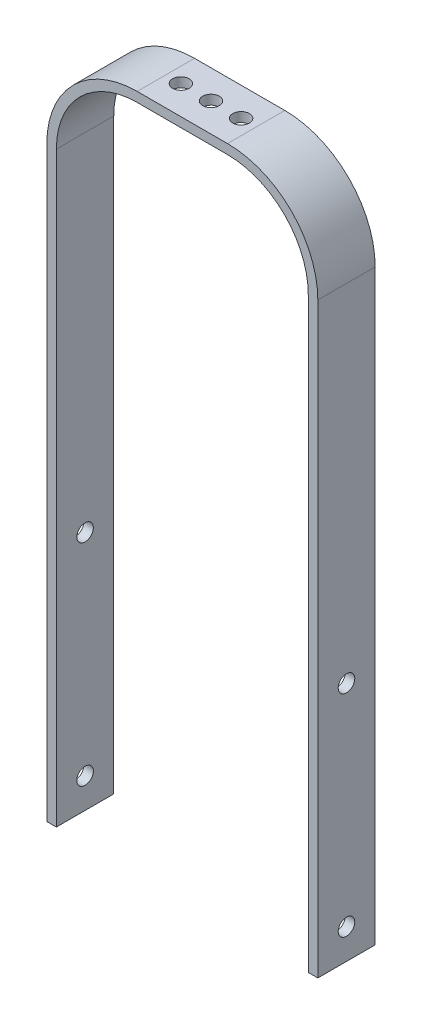
ISO-10303-21;
HEADER;
FILE_DESCRIPTION(('STEP AP214'),'2;1');
FILE_NAME('part.step','',(''),(''),'','','');
FILE_SCHEMA(('AUTOMOTIVE_DESIGN { 1 0 10303 214 1 1 1 1 }'));
ENDSEC;
DATA;
#1=APPLICATION_CONTEXT('core data for automotive mechanical design processes');
#2=APPLICATION_PROTOCOL_DEFINITION('international standard','automotive_design',2000,#1);
#3=PRODUCT_CONTEXT('',#1,'mechanical');
#4=PRODUCT('Part','Part','',(#3));
#5=PRODUCT_RELATED_PRODUCT_CATEGORY('part','',(#4));
#6=PRODUCT_DEFINITION_FORMATION('','',#4);
#7=PRODUCT_DEFINITION_CONTEXT('part definition',#1,'design');
#8=PRODUCT_DEFINITION('design','',#6,#7);
#9=PRODUCT_DEFINITION_SHAPE('','',#8);
#10=(LENGTH_UNIT() NAMED_UNIT(*) SI_UNIT(.MILLI.,.METRE.));
#11=(NAMED_UNIT(*) PLANE_ANGLE_UNIT() SI_UNIT($,.RADIAN.));
#12=(NAMED_UNIT(*) SI_UNIT($,.STERADIAN.) SOLID_ANGLE_UNIT());
#13=UNCERTAINTY_MEASURE_WITH_UNIT(LENGTH_MEASURE(1.E-05),#10,'distance_accuracy_value','');
#14=(GEOMETRIC_REPRESENTATION_CONTEXT(3) GLOBAL_UNCERTAINTY_ASSIGNED_CONTEXT((#13)) GLOBAL_UNIT_ASSIGNED_CONTEXT((#10,
#11,#12)) REPRESENTATION_CONTEXT('',''));
#15=CARTESIAN_POINT('',(0.,0.,0.));
#16=DIRECTION('',(0.,0.,1.));
#17=DIRECTION('',(1.,0.,0.));
#18=AXIS2_PLACEMENT_3D('',#15,#16,#17);
#19=CARTESIAN_POINT('',(41.825,45.,9.525));
#20=DIRECTION('',(0.,1.,0.));
#21=DIRECTION('',(0.,0.,1.));
#22=AXIS2_PLACEMENT_3D('',#19,#20,#21);
#23=PLANE('',#22);
#24=DIRECTION('',(1.,0.,0.));
#25=VECTOR('',#24,1.);
#26=CARTESIAN_POINT('',(41.825,45.,-9.525));
#27=LINE('',#26,#25);
#28=CARTESIAN_POINT('',(41.825,45.,-9.525));
#29=VERTEX_POINT('',#28);
#30=CARTESIAN_POINT('',(45.,45.,-9.525));
#31=VERTEX_POINT('',#30);
#32=EDGE_CURVE('E155',#29,#31,#27,.T.);
#33=ORIENTED_EDGE('',*,*,#32,.T.);
#34=DIRECTION('',(0.,0.,-1.));
#35=VECTOR('',#34,1.);
#36=CARTESIAN_POINT('',(45.,45.,9.525));
#37=LINE('',#36,#35);
#38=CARTESIAN_POINT('',(45.,45.,9.525));
#39=VERTEX_POINT('',#38);
#40=EDGE_CURVE('E11',#39,#31,#37,.T.);
#41=ORIENTED_EDGE('',*,*,#40,.F.);
#42=DIRECTION('',(1.,0.,0.));
#43=VECTOR('',#42,1.);
#44=CARTESIAN_POINT('',(41.825,45.,9.525));
#45=LINE('',#44,#43);
#46=CARTESIAN_POINT('',(41.825,45.,9.525));
#47=VERTEX_POINT('',#46);
#48=EDGE_CURVE('E178',#47,#39,#45,.T.);
#49=ORIENTED_EDGE('',*,*,#48,.F.);
#50=DIRECTION('',(0.,0.,-1.));
#51=VECTOR('',#50,1.);
#52=CARTESIAN_POINT('',(41.825,45.,9.525));
#53=LINE('',#52,#51);
#54=EDGE_CURVE('E151',#47,#29,#53,.T.);
#55=ORIENTED_EDGE('',*,*,#54,.T.);
#56=EDGE_LOOP('',(#33,#41,#49,#55));
#57=FACE_BOUND('',#56,.T.);
#58=ADVANCED_FACE('F33',(#57),#23,.F.);
#59=CARTESIAN_POINT('',(45.,45.,9.525));
#60=DIRECTION('',(-1.,0.,0.));
#61=DIRECTION('',(0.,-1.,0.));
#62=AXIS2_PLACEMENT_3D('',#59,#60,#61);
#63=PLANE('',#62);
#64=CARTESIAN_POINT('',(45.,125.,-1.00670632616219E-12));
#65=DIRECTION('',(-1.,0.,0.));
#66=DIRECTION('',(0.,-1.,0.));
#67=AXIS2_PLACEMENT_3D('',#64,#65,#66);
#68=CIRCLE('',#67,2.75);
#69=CARTESIAN_POINT('',(45.,127.75,-1.00670632616219E-12));
#70=VERTEX_POINT('',#69);
#71=EDGE_CURVE('E232',#70,#70,#68,.T.);
#72=ORIENTED_EDGE('',*,*,#71,.T.);
#73=EDGE_LOOP('',(#72));
#74=FACE_BOUND('',#73,.T.);
#75=CARTESIAN_POINT('',(45.,55.,-1.78065548281E-12));
#76=DIRECTION('',(-1.,0.,0.));
#77=DIRECTION('',(0.,-1.,0.));
#78=AXIS2_PLACEMENT_3D('',#75,#76,#77);
#79=CIRCLE('',#78,2.75);
#80=CARTESIAN_POINT('',(45.,57.75,-1.78065548281E-12));
#81=VERTEX_POINT('',#80);
#82=EDGE_CURVE('E217',#81,#81,#79,.T.);
#83=ORIENTED_EDGE('',*,*,#82,.T.);
#84=EDGE_LOOP('',(#83));
#85=FACE_BOUND('',#84,.T.);
#86=DIRECTION('',(0.,1.,0.));
#87=VECTOR('',#86,1.);
#88=CARTESIAN_POINT('',(45.,45.,-9.525));
#89=LINE('',#88,#87);
#90=CARTESIAN_POINT('',(45.,240.,-9.525));
#91=VERTEX_POINT('',#90);
#92=EDGE_CURVE('E158',#31,#91,#89,.T.);
#93=ORIENTED_EDGE('',*,*,#92,.T.);
#94=DIRECTION('',(0.,0.,-1.));
#95=VECTOR('',#94,1.);
#96=CARTESIAN_POINT('',(45.,240.,9.525));
#97=LINE('',#96,#95);
#98=CARTESIAN_POINT('',(45.,240.,9.525));
#99=VERTEX_POINT('',#98);
#100=EDGE_CURVE('E42',#99,#91,#97,.T.);
#101=ORIENTED_EDGE('',*,*,#100,.F.);
#102=DIRECTION('',(0.,1.,0.));
#103=VECTOR('',#102,1.);
#104=CARTESIAN_POINT('',(45.,45.,9.525));
#105=LINE('',#104,#103);
#106=EDGE_CURVE('E106',#39,#99,#105,.T.);
#107=ORIENTED_EDGE('',*,*,#106,.F.);
#108=ORIENTED_EDGE('',*,*,#40,.T.);
#109=EDGE_LOOP('',(#93,#101,#107,#108));
#110=FACE_BOUND('',#109,.T.);
#111=ADVANCED_FACE('F286',(#74,#85,#110),#63,.F.);
#112=CARTESIAN_POINT('',(15.,240.,9.525));
#113=DIRECTION('',(0.,0.,-1.));
#114=DIRECTION('',(-1.,0.,0.));
#115=AXIS2_PLACEMENT_3D('',#112,#113,#114);
#116=CYLINDRICAL_SURFACE('',#115,30.);
#117=CARTESIAN_POINT('',(15.,240.,-9.525));
#118=DIRECTION('',(0.,0.,1.));
#119=DIRECTION('',(1.,0.,0.));
#120=AXIS2_PLACEMENT_3D('',#117,#118,#119);
#121=CIRCLE('',#120,30.);
#122=CARTESIAN_POINT('',(15.,270.,-9.525));
#123=VERTEX_POINT('',#122);
#124=EDGE_CURVE('E161',#91,#123,#121,.T.);
#125=ORIENTED_EDGE('',*,*,#124,.T.);
#126=DIRECTION('',(0.,0.,-1.));
#127=VECTOR('',#126,1.);
#128=CARTESIAN_POINT('',(15.,270.,9.525));
#129=LINE('',#128,#127);
#130=CARTESIAN_POINT('',(15.,270.,9.525));
#131=VERTEX_POINT('',#130);
#132=EDGE_CURVE('E197',#131,#123,#129,.T.);
#133=ORIENTED_EDGE('',*,*,#132,.F.);
#134=CARTESIAN_POINT('',(15.,240.,9.525));
#135=DIRECTION('',(0.,0.,1.));
#136=DIRECTION('',(1.,0.,0.));
#137=AXIS2_PLACEMENT_3D('',#134,#135,#136);
#138=CIRCLE('',#137,30.);
#139=EDGE_CURVE('E245',#99,#131,#138,.T.);
#140=ORIENTED_EDGE('',*,*,#139,.F.);
#141=ORIENTED_EDGE('',*,*,#100,.T.);
#142=EDGE_LOOP('',(#125,#133,#140,#141));
#143=FACE_BOUND('',#142,.T.);
#144=ADVANCED_FACE('F290',(#143),#116,.T.);
#145=CARTESIAN_POINT('',(15.,270.,9.525));
#146=DIRECTION('',(0.,-1.,0.));
#147=DIRECTION('',(0.,0.,-1.));
#148=AXIS2_PLACEMENT_3D('',#145,#146,#147);
#149=PLANE('',#148);
#150=CARTESIAN_POINT('',(9.99999999999996,270.,0.));
#151=DIRECTION('',(0.,1.,0.));
#152=DIRECTION('',(0.,0.,1.));
#153=AXIS2_PLACEMENT_3D('',#150,#151,#152);
#154=CIRCLE('',#153,2.75);
#155=CARTESIAN_POINT('',(9.99999999999996,270.,2.75));
#156=VERTEX_POINT('',#155);
#157=EDGE_CURVE('E235',#156,#156,#154,.T.);
#158=ORIENTED_EDGE('',*,*,#157,.F.);
#159=EDGE_LOOP('',(#158));
#160=FACE_BOUND('',#159,.T.);
#161=CARTESIAN_POINT('',(-9.99999999999996,270.,0.));
#162=DIRECTION('',(0.,1.,0.));
#163=DIRECTION('',(0.,0.,1.));
#164=AXIS2_PLACEMENT_3D('',#161,#162,#163);
#165=CIRCLE('',#164,2.75);
#166=CARTESIAN_POINT('',(-9.99999999999996,270.,2.75));
#167=VERTEX_POINT('',#166);
#168=EDGE_CURVE('E236',#167,#167,#165,.T.);
#169=ORIENTED_EDGE('',*,*,#168,.F.);
#170=EDGE_LOOP('',(#169));
#171=FACE_BOUND('',#170,.T.);
#172=CARTESIAN_POINT('',(0.,270.,0.));
#173=DIRECTION('',(0.,1.,0.));
#174=DIRECTION('',(0.,0.,1.));
#175=AXIS2_PLACEMENT_3D('',#172,#173,#174);
#176=CIRCLE('',#175,2.75);
#177=CARTESIAN_POINT('',(0.,270.,2.75));
#178=VERTEX_POINT('',#177);
#179=EDGE_CURVE('E206',#178,#178,#176,.T.);
#180=ORIENTED_EDGE('',*,*,#179,.F.);
#181=EDGE_LOOP('',(#180));
#182=FACE_BOUND('',#181,.T.);
#183=DIRECTION('',(-1.,0.,0.));
#184=VECTOR('',#183,1.);
#185=CARTESIAN_POINT('',(15.,270.,-9.525));
#186=LINE('',#185,#184);
#187=CARTESIAN_POINT('',(-15.,270.,-9.525));
#188=VERTEX_POINT('',#187);
#189=EDGE_CURVE('E163',#123,#188,#186,.T.);
#190=ORIENTED_EDGE('',*,*,#189,.T.);
#191=DIRECTION('',(0.,0.,-1.));
#192=VECTOR('',#191,1.);
#193=CARTESIAN_POINT('',(-15.,270.,9.525));
#194=LINE('',#193,#192);
#195=CARTESIAN_POINT('',(-15.,270.,9.525));
#196=VERTEX_POINT('',#195);
#197=EDGE_CURVE('E194',#196,#188,#194,.T.);
#198=ORIENTED_EDGE('',*,*,#197,.F.);
#199=DIRECTION('',(-1.,0.,0.));
#200=VECTOR('',#199,1.);
#201=CARTESIAN_POINT('',(15.,270.,9.525));
#202=LINE('',#201,#200);
#203=EDGE_CURVE('E247',#131,#196,#202,.T.);
#204=ORIENTED_EDGE('',*,*,#203,.F.);
#205=ORIENTED_EDGE('',*,*,#132,.T.);
#206=EDGE_LOOP('',(#190,#198,#204,#205));
#207=FACE_BOUND('',#206,.T.);
#208=ADVANCED_FACE('F295',(#160,#171,#182,#207),#149,.F.);
#209=CARTESIAN_POINT('',(-15.,240.,9.525));
#210=DIRECTION('',(0.,0.,-1.));
#211=DIRECTION('',(-1.,0.,0.));
#212=AXIS2_PLACEMENT_3D('',#209,#210,#211);
#213=CYLINDRICAL_SURFACE('',#212,30.);
#214=CARTESIAN_POINT('',(-15.,240.,-9.525));
#215=DIRECTION('',(0.,0.,1.));
#216=DIRECTION('',(-1.,0.,0.));
#217=AXIS2_PLACEMENT_3D('',#214,#215,#216);
#218=CIRCLE('',#217,30.);
#219=CARTESIAN_POINT('',(-45.,240.,-9.525));
#220=VERTEX_POINT('',#219);
#221=EDGE_CURVE('E165',#188,#220,#218,.T.);
#222=ORIENTED_EDGE('',*,*,#221,.T.);
#223=DIRECTION('',(0.,0.,-1.));
#224=VECTOR('',#223,1.);
#225=CARTESIAN_POINT('',(-45.,240.,9.525));
#226=LINE('',#225,#224);
#227=CARTESIAN_POINT('',(-45.,240.,9.525));
#228=VERTEX_POINT('',#227);
#229=EDGE_CURVE('E191',#228,#220,#226,.T.);
#230=ORIENTED_EDGE('',*,*,#229,.F.);
#231=CARTESIAN_POINT('',(-15.,240.,9.525));
#232=DIRECTION('',(0.,0.,1.));
#233=DIRECTION('',(-1.,0.,0.));
#234=AXIS2_PLACEMENT_3D('',#231,#232,#233);
#235=CIRCLE('',#234,30.);
#236=EDGE_CURVE('E249',#196,#228,#235,.T.);
#237=ORIENTED_EDGE('',*,*,#236,.F.);
#238=ORIENTED_EDGE('',*,*,#197,.T.);
#239=EDGE_LOOP('',(#222,#230,#237,#238));
#240=FACE_BOUND('',#239,.T.);
#241=ADVANCED_FACE('F302',(#240),#213,.T.);
#242=CARTESIAN_POINT('',(-45.,45.,9.525));
#243=DIRECTION('',(1.,0.,0.));
#244=DIRECTION('',(0.,1.,0.));
#245=AXIS2_PLACEMENT_3D('',#242,#243,#244);
#246=PLANE('',#245);
#247=CARTESIAN_POINT('',(-45.,125.,-1.00670632616219E-12));
#248=DIRECTION('',(1.,0.,0.));
#249=DIRECTION('',(0.,1.,0.));
#250=AXIS2_PLACEMENT_3D('',#247,#248,#249);
#251=CIRCLE('',#250,2.75);
#252=CARTESIAN_POINT('',(-45.,127.75,-1.00670632616219E-12));
#253=VERTEX_POINT('',#252);
#254=EDGE_CURVE('E213',#253,#253,#251,.T.);
#255=ORIENTED_EDGE('',*,*,#254,.T.);
#256=EDGE_LOOP('',(#255));
#257=FACE_BOUND('',#256,.T.);
#258=CARTESIAN_POINT('',(-45.,55.,-1.78065548281E-12));
#259=DIRECTION('',(1.,0.,0.));
#260=DIRECTION('',(0.,1.,0.));
#261=AXIS2_PLACEMENT_3D('',#258,#259,#260);
#262=CIRCLE('',#261,2.75);
#263=CARTESIAN_POINT('',(-45.,57.75,-1.78065548281E-12));
#264=VERTEX_POINT('',#263);
#265=EDGE_CURVE('E220',#264,#264,#262,.T.);
#266=ORIENTED_EDGE('',*,*,#265,.T.);
#267=EDGE_LOOP('',(#266));
#268=FACE_BOUND('',#267,.T.);
#269=DIRECTION('',(0.,-1.,0.));
#270=VECTOR('',#269,1.);
#271=CARTESIAN_POINT('',(-45.,45.,-9.525));
#272=LINE('',#271,#270);
#273=CARTESIAN_POINT('',(-45.,45.,-9.525));
#274=VERTEX_POINT('',#273);
#275=EDGE_CURVE('E167',#220,#274,#272,.T.);
#276=ORIENTED_EDGE('',*,*,#275,.T.);
#277=DIRECTION('',(0.,0.,-1.));
#278=VECTOR('',#277,1.);
#279=CARTESIAN_POINT('',(-45.,45.,9.525));
#280=LINE('',#279,#278);
#281=CARTESIAN_POINT('',(-45.,45.,9.525));
#282=VERTEX_POINT('',#281);
#283=EDGE_CURVE('E188',#282,#274,#280,.T.);
#284=ORIENTED_EDGE('',*,*,#283,.F.);
#285=DIRECTION('',(0.,-1.,0.));
#286=VECTOR('',#285,1.);
#287=CARTESIAN_POINT('',(-45.,45.,9.525));
#288=LINE('',#287,#286);
#289=EDGE_CURVE('E251',#228,#282,#288,.T.);
#290=ORIENTED_EDGE('',*,*,#289,.F.);
#291=ORIENTED_EDGE('',*,*,#229,.T.);
#292=EDGE_LOOP('',(#276,#284,#290,#291));
#293=FACE_BOUND('',#292,.T.);
#294=ADVANCED_FACE('F306',(#257,#268,#293),#246,.F.);
#295=CARTESIAN_POINT('',(-45.,45.,9.525));
#296=DIRECTION('',(0.,1.,0.));
#297=DIRECTION('',(0.,0.,1.));
#298=AXIS2_PLACEMENT_3D('',#295,#296,#297);
#299=PLANE('',#298);
#300=DIRECTION('',(1.,0.,0.));
#301=VECTOR('',#300,1.);
#302=CARTESIAN_POINT('',(-45.,45.,-9.525));
#303=LINE('',#302,#301);
#304=CARTESIAN_POINT('',(-41.825,45.,-9.525));
#305=VERTEX_POINT('',#304);
#306=EDGE_CURVE('E169',#274,#305,#303,.T.);
#307=ORIENTED_EDGE('',*,*,#306,.T.);
#308=DIRECTION('',(0.,0.,-1.));
#309=VECTOR('',#308,1.);
#310=CARTESIAN_POINT('',(-41.825,45.,9.525));
#311=LINE('',#310,#309);
#312=CARTESIAN_POINT('',(-41.825,45.,9.525));
#313=VERTEX_POINT('',#312);
#314=EDGE_CURVE('E185',#313,#305,#311,.T.);
#315=ORIENTED_EDGE('',*,*,#314,.F.);
#316=DIRECTION('',(1.,0.,0.));
#317=VECTOR('',#316,1.);
#318=CARTESIAN_POINT('',(-45.,45.,9.525));
#319=LINE('',#318,#317);
#320=EDGE_CURVE('E253',#282,#313,#319,.T.);
#321=ORIENTED_EDGE('',*,*,#320,.F.);
#322=ORIENTED_EDGE('',*,*,#283,.T.);
#323=EDGE_LOOP('',(#307,#315,#321,#322));
#324=FACE_BOUND('',#323,.T.);
#325=ADVANCED_FACE('F310',(#324),#299,.F.);
#326=CARTESIAN_POINT('',(-41.825,240.,9.525));
#327=DIRECTION('',(-1.,0.,0.));
#328=DIRECTION('',(0.,-1.,0.));
#329=AXIS2_PLACEMENT_3D('',#326,#327,#328);
#330=PLANE('',#329);
#331=CARTESIAN_POINT('',(-41.825,125.,-1.00670632616219E-12));
#332=DIRECTION('',(-1.,0.,0.));
#333=DIRECTION('',(0.,-1.,0.));
#334=AXIS2_PLACEMENT_3D('',#331,#332,#333);
#335=CIRCLE('',#334,2.75);
#336=CARTESIAN_POINT('',(-41.825,122.25,-1.00670632616219E-12));
#337=VERTEX_POINT('',#336);
#338=EDGE_CURVE('E229',#337,#337,#335,.T.);
#339=ORIENTED_EDGE('',*,*,#338,.T.);
#340=EDGE_LOOP('',(#339));
#341=FACE_BOUND('',#340,.T.);
#342=CARTESIAN_POINT('',(-41.825,55.,-1.78065548281E-12));
#343=DIRECTION('',(-1.,0.,0.));
#344=DIRECTION('',(0.,-1.,0.));
#345=AXIS2_PLACEMENT_3D('',#342,#343,#344);
#346=CIRCLE('',#345,2.75);
#347=CARTESIAN_POINT('',(-41.825,52.25,-1.78065548281E-12));
#348=VERTEX_POINT('',#347);
#349=EDGE_CURVE('E212',#348,#348,#346,.T.);
#350=ORIENTED_EDGE('',*,*,#349,.T.);
#351=EDGE_LOOP('',(#350));
#352=FACE_BOUND('',#351,.T.);
#353=DIRECTION('',(0.,1.,0.));
#354=VECTOR('',#353,1.);
#355=CARTESIAN_POINT('',(-41.825,240.,-9.525));
#356=LINE('',#355,#354);
#357=CARTESIAN_POINT('',(-41.825,240.,-9.525));
#358=VERTEX_POINT('',#357);
#359=EDGE_CURVE('E171',#305,#358,#356,.T.);
#360=ORIENTED_EDGE('',*,*,#359,.T.);
#361=DIRECTION('',(0.,0.,-1.));
#362=VECTOR('',#361,1.);
#363=CARTESIAN_POINT('',(-41.825,240.,9.525));
#364=LINE('',#363,#362);
#365=CARTESIAN_POINT('',(-41.825,240.,9.525));
#366=VERTEX_POINT('',#365);
#367=EDGE_CURVE('E182',#366,#358,#364,.T.);
#368=ORIENTED_EDGE('',*,*,#367,.F.);
#369=DIRECTION('',(0.,1.,0.));
#370=VECTOR('',#369,1.);
#371=CARTESIAN_POINT('',(-41.825,240.,9.525));
#372=LINE('',#371,#370);
#373=EDGE_CURVE('E255',#313,#366,#372,.T.);
#374=ORIENTED_EDGE('',*,*,#373,.F.);
#375=ORIENTED_EDGE('',*,*,#314,.T.);
#376=EDGE_LOOP('',(#360,#368,#374,#375));
#377=FACE_BOUND('',#376,.T.);
#378=ADVANCED_FACE('F261',(#341,#352,#377),#330,.F.);
#379=CARTESIAN_POINT('',(-15.,240.,9.525));
#380=DIRECTION('',(0.,0.,-1.));
#381=DIRECTION('',(-1.,0.,0.));
#382=AXIS2_PLACEMENT_3D('',#379,#380,#381);
#383=CYLINDRICAL_SURFACE('',#382,26.825);
#384=CARTESIAN_POINT('',(-15.,240.,-9.525));
#385=DIRECTION('',(0.,0.,-1.));
#386=DIRECTION('',(1.,0.,0.));
#387=AXIS2_PLACEMENT_3D('',#384,#385,#386);
#388=CIRCLE('',#387,26.825);
#389=CARTESIAN_POINT('',(-15.,266.825,-9.525));
#390=VERTEX_POINT('',#389);
#391=EDGE_CURVE('E173',#358,#390,#388,.T.);
#392=ORIENTED_EDGE('',*,*,#391,.T.);
#393=DIRECTION('',(0.,0.,-1.));
#394=VECTOR('',#393,1.);
#395=CARTESIAN_POINT('',(-15.,266.825,9.525));
#396=LINE('',#395,#394);
#397=CARTESIAN_POINT('',(-15.,266.825,9.525));
#398=VERTEX_POINT('',#397);
#399=EDGE_CURVE('E146',#398,#390,#396,.T.);
#400=ORIENTED_EDGE('',*,*,#399,.F.);
#401=CARTESIAN_POINT('',(-15.,240.,9.525));
#402=DIRECTION('',(0.,0.,-1.));
#403=DIRECTION('',(1.,0.,0.));
#404=AXIS2_PLACEMENT_3D('',#401,#402,#403);
#405=CIRCLE('',#404,26.825);
#406=EDGE_CURVE('E137',#366,#398,#405,.T.);
#407=ORIENTED_EDGE('',*,*,#406,.F.);
#408=ORIENTED_EDGE('',*,*,#367,.T.);
#409=EDGE_LOOP('',(#392,#400,#407,#408));
#410=FACE_BOUND('',#409,.T.);
#411=ADVANCED_FACE('F265',(#410),#383,.F.);
#412=CARTESIAN_POINT('',(-15.,266.825,9.525));
#413=DIRECTION('',(0.,1.,0.));
#414=DIRECTION('',(0.,0.,1.));
#415=AXIS2_PLACEMENT_3D('',#412,#413,#414);
#416=PLANE('',#415);
#417=CARTESIAN_POINT('',(9.99999999999996,266.825,0.));
#418=DIRECTION('',(0.,1.,0.));
#419=DIRECTION('',(0.,0.,1.));
#420=AXIS2_PLACEMENT_3D('',#417,#418,#419);
#421=CIRCLE('',#420,2.75);
#422=CARTESIAN_POINT('',(9.99999999999996,266.825,2.75));
#423=VERTEX_POINT('',#422);
#424=EDGE_CURVE('E159',#423,#423,#421,.T.);
#425=ORIENTED_EDGE('',*,*,#424,.T.);
#426=EDGE_LOOP('',(#425));
#427=FACE_BOUND('',#426,.T.);
#428=CARTESIAN_POINT('',(-9.99999999999996,266.825,0.));
#429=DIRECTION('',(0.,1.,0.));
#430=DIRECTION('',(0.,0.,1.));
#431=AXIS2_PLACEMENT_3D('',#428,#429,#430);
#432=CIRCLE('',#431,2.75);
#433=CARTESIAN_POINT('',(-9.99999999999996,266.825,2.75));
#434=VERTEX_POINT('',#433);
#435=EDGE_CURVE('E205',#434,#434,#432,.T.);
#436=ORIENTED_EDGE('',*,*,#435,.T.);
#437=EDGE_LOOP('',(#436));
#438=FACE_BOUND('',#437,.T.);
#439=CARTESIAN_POINT('',(0.,266.825,0.));
#440=DIRECTION('',(0.,1.,0.));
#441=DIRECTION('',(0.,0.,1.));
#442=AXIS2_PLACEMENT_3D('',#439,#440,#441);
#443=CIRCLE('',#442,2.75);
#444=CARTESIAN_POINT('',(0.,266.825,2.75));
#445=VERTEX_POINT('',#444);
#446=EDGE_CURVE('E202',#445,#445,#443,.T.);
#447=ORIENTED_EDGE('',*,*,#446,.T.);
#448=EDGE_LOOP('',(#447));
#449=FACE_BOUND('',#448,.T.);
#450=DIRECTION('',(1.,0.,0.));
#451=VECTOR('',#450,1.);
#452=CARTESIAN_POINT('',(-15.,266.825,-9.525));
#453=LINE('',#452,#451);
#454=CARTESIAN_POINT('',(15.,266.825,-9.525));
#455=VERTEX_POINT('',#454);
#456=EDGE_CURVE('E145',#390,#455,#453,.T.);
#457=ORIENTED_EDGE('',*,*,#456,.T.);
#458=DIRECTION('',(0.,0.,-1.));
#459=VECTOR('',#458,1.);
#460=CARTESIAN_POINT('',(15.,266.825,9.525));
#461=LINE('',#460,#459);
#462=CARTESIAN_POINT('',(15.,266.825,9.525));
#463=VERTEX_POINT('',#462);
#464=EDGE_CURVE('E142',#463,#455,#461,.T.);
#465=ORIENTED_EDGE('',*,*,#464,.F.);
#466=DIRECTION('',(1.,0.,0.));
#467=VECTOR('',#466,1.);
#468=CARTESIAN_POINT('',(-15.,266.825,9.525));
#469=LINE('',#468,#467);
#470=EDGE_CURVE('E131',#398,#463,#469,.T.);
#471=ORIENTED_EDGE('',*,*,#470,.F.);
#472=ORIENTED_EDGE('',*,*,#399,.T.);
#473=EDGE_LOOP('',(#457,#465,#471,#472));
#474=FACE_BOUND('',#473,.T.);
#475=ADVANCED_FACE('F143',(#427,#438,#449,#474),#416,.F.);
#476=CARTESIAN_POINT('',(15.,240.,9.525));
#477=DIRECTION('',(0.,0.,-1.));
#478=DIRECTION('',(-1.,0.,0.));
#479=AXIS2_PLACEMENT_3D('',#476,#477,#478);
#480=CYLINDRICAL_SURFACE('',#479,26.825);
#481=CARTESIAN_POINT('',(15.,240.,-9.525));
#482=DIRECTION('',(0.,0.,-1.));
#483=DIRECTION('',(-1.,0.,0.));
#484=AXIS2_PLACEMENT_3D('',#481,#482,#483);
#485=CIRCLE('',#484,26.825);
#486=CARTESIAN_POINT('',(41.825,240.,-9.525));
#487=VERTEX_POINT('',#486);
#488=EDGE_CURVE('E92',#455,#487,#485,.T.);
#489=ORIENTED_EDGE('',*,*,#488,.T.);
#490=DIRECTION('',(0.,0.,-1.));
#491=VECTOR('',#490,1.);
#492=CARTESIAN_POINT('',(41.825,240.,9.525));
#493=LINE('',#492,#491);
#494=CARTESIAN_POINT('',(41.825,240.,9.525));
#495=VERTEX_POINT('',#494);
#496=EDGE_CURVE('E147',#495,#487,#493,.T.);
#497=ORIENTED_EDGE('',*,*,#496,.F.);
#498=CARTESIAN_POINT('',(15.,240.,9.525));
#499=DIRECTION('',(0.,0.,-1.));
#500=DIRECTION('',(-1.,0.,0.));
#501=AXIS2_PLACEMENT_3D('',#498,#499,#500);
#502=CIRCLE('',#501,26.825);
#503=EDGE_CURVE('E135',#463,#495,#502,.T.);
#504=ORIENTED_EDGE('',*,*,#503,.F.);
#505=ORIENTED_EDGE('',*,*,#464,.T.);
#506=EDGE_LOOP('',(#489,#497,#504,#505));
#507=FACE_BOUND('',#506,.T.);
#508=ADVANCED_FACE('F149',(#507),#480,.F.);
#509=CARTESIAN_POINT('',(41.825,240.,9.525));
#510=DIRECTION('',(1.,0.,0.));
#511=DIRECTION('',(0.,1.,0.));
#512=AXIS2_PLACEMENT_3D('',#509,#510,#511);
#513=PLANE('',#512);
#514=CARTESIAN_POINT('',(41.825,125.,-1.00670632616219E-12));
#515=DIRECTION('',(1.,0.,0.));
#516=DIRECTION('',(0.,1.,0.));
#517=AXIS2_PLACEMENT_3D('',#514,#515,#516);
#518=CIRCLE('',#517,2.75);
#519=CARTESIAN_POINT('',(41.825,127.75,-1.00670632616219E-12));
#520=VERTEX_POINT('',#519);
#521=EDGE_CURVE('E36',#520,#520,#518,.T.);
#522=ORIENTED_EDGE('',*,*,#521,.T.);
#523=EDGE_LOOP('',(#522));
#524=FACE_BOUND('',#523,.T.);
#525=CARTESIAN_POINT('',(41.825,55.,-1.78065548281E-12));
#526=DIRECTION('',(1.,0.,0.));
#527=DIRECTION('',(0.,1.,0.));
#528=AXIS2_PLACEMENT_3D('',#525,#526,#527);
#529=CIRCLE('',#528,2.75);
#530=CARTESIAN_POINT('',(41.825,57.75,-1.78065548281E-12));
#531=VERTEX_POINT('',#530);
#532=EDGE_CURVE('E210',#531,#531,#529,.T.);
#533=ORIENTED_EDGE('',*,*,#532,.T.);
#534=EDGE_LOOP('',(#533));
#535=FACE_BOUND('',#534,.T.);
#536=DIRECTION('',(0.,-1.,0.));
#537=VECTOR('',#536,1.);
#538=CARTESIAN_POINT('',(41.825,240.,-9.525));
#539=LINE('',#538,#537);
#540=EDGE_CURVE('E98',#487,#29,#539,.T.);
#541=ORIENTED_EDGE('',*,*,#540,.T.);
#542=ORIENTED_EDGE('',*,*,#54,.F.);
#543=DIRECTION('',(0.,-1.,0.));
#544=VECTOR('',#543,1.);
#545=CARTESIAN_POINT('',(41.825,240.,9.525));
#546=LINE('',#545,#544);
#547=EDGE_CURVE('E51',#495,#47,#546,.T.);
#548=ORIENTED_EDGE('',*,*,#547,.F.);
#549=ORIENTED_EDGE('',*,*,#496,.T.);
#550=EDGE_LOOP('',(#541,#542,#548,#549));
#551=FACE_BOUND('',#550,.T.);
#552=ADVANCED_FACE('F273',(#524,#535,#551),#513,.F.);
#553=CARTESIAN_POINT('',(15.,240.,9.525));
#554=DIRECTION('',(0.,0.,1.));
#555=DIRECTION('',(1.,0.,0.));
#556=AXIS2_PLACEMENT_3D('',#553,#554,#555);
#557=PLANE('',#556);
#558=ORIENTED_EDGE('',*,*,#48,.T.);
#559=ORIENTED_EDGE('',*,*,#106,.T.);
#560=ORIENTED_EDGE('',*,*,#139,.T.);
#561=ORIENTED_EDGE('',*,*,#203,.T.);
#562=ORIENTED_EDGE('',*,*,#236,.T.);
#563=ORIENTED_EDGE('',*,*,#289,.T.);
#564=ORIENTED_EDGE('',*,*,#320,.T.);
#565=ORIENTED_EDGE('',*,*,#373,.T.);
#566=ORIENTED_EDGE('',*,*,#406,.T.);
#567=ORIENTED_EDGE('',*,*,#470,.T.);
#568=ORIENTED_EDGE('',*,*,#503,.T.);
#569=ORIENTED_EDGE('',*,*,#547,.T.);
#570=EDGE_LOOP('',(#558,#559,#560,#561,#562,#563,#564,#565,#566,#567,#568,#569));
#571=FACE_BOUND('',#570,.T.);
#572=ADVANCED_FACE('F133',(#571),#557,.T.);
#573=CARTESIAN_POINT('',(15.,240.,-9.525));
#574=DIRECTION('',(0.,0.,1.));
#575=DIRECTION('',(1.,0.,0.));
#576=AXIS2_PLACEMENT_3D('',#573,#574,#575);
#577=PLANE('',#576);
#578=ORIENTED_EDGE('',*,*,#32,.F.);
#579=ORIENTED_EDGE('',*,*,#540,.F.);
#580=ORIENTED_EDGE('',*,*,#488,.F.);
#581=ORIENTED_EDGE('',*,*,#456,.F.);
#582=ORIENTED_EDGE('',*,*,#391,.F.);
#583=ORIENTED_EDGE('',*,*,#359,.F.);
#584=ORIENTED_EDGE('',*,*,#306,.F.);
#585=ORIENTED_EDGE('',*,*,#275,.F.);
#586=ORIENTED_EDGE('',*,*,#221,.F.);
#587=ORIENTED_EDGE('',*,*,#189,.F.);
#588=ORIENTED_EDGE('',*,*,#124,.F.);
#589=ORIENTED_EDGE('',*,*,#92,.F.);
#590=EDGE_LOOP('',(#578,#579,#580,#581,#582,#583,#584,#585,#586,#587,#588,#589));
#591=FACE_BOUND('',#590,.T.);
#592=ADVANCED_FACE('F268',(#591),#577,.F.);
#593=CARTESIAN_POINT('',(0.,45.,0.));
#594=DIRECTION('',(0.,1.,0.));
#595=DIRECTION('',(0.,0.,1.));
#596=AXIS2_PLACEMENT_3D('',#593,#594,#595);
#597=CYLINDRICAL_SURFACE('',#596,2.75);
#598=ORIENTED_EDGE('',*,*,#179,.T.);
#599=EDGE_LOOP('',(#598));
#600=FACE_BOUND('',#599,.T.);
#601=ORIENTED_EDGE('',*,*,#446,.F.);
#602=EDGE_LOOP('',(#601));
#603=FACE_BOUND('',#602,.T.);
#604=ADVANCED_FACE('F329',(#600,#603),#597,.F.);
#605=CARTESIAN_POINT('',(-9.99999999999996,45.,0.));
#606=DIRECTION('',(0.,1.,0.));
#607=DIRECTION('',(0.,0.,1.));
#608=AXIS2_PLACEMENT_3D('',#605,#606,#607);
#609=CYLINDRICAL_SURFACE('',#608,2.75);
#610=ORIENTED_EDGE('',*,*,#168,.T.);
#611=EDGE_LOOP('',(#610));
#612=FACE_BOUND('',#611,.T.);
#613=ORIENTED_EDGE('',*,*,#435,.F.);
#614=EDGE_LOOP('',(#613));
#615=FACE_BOUND('',#614,.T.);
#616=ADVANCED_FACE('F331',(#612,#615),#609,.F.);
#617=CARTESIAN_POINT('',(9.99999999999996,45.,0.));
#618=DIRECTION('',(0.,1.,0.));
#619=DIRECTION('',(0.,0.,1.));
#620=AXIS2_PLACEMENT_3D('',#617,#618,#619);
#621=CYLINDRICAL_SURFACE('',#620,2.75);
#622=ORIENTED_EDGE('',*,*,#157,.T.);
#623=EDGE_LOOP('',(#622));
#624=FACE_BOUND('',#623,.T.);
#625=ORIENTED_EDGE('',*,*,#424,.F.);
#626=EDGE_LOOP('',(#625));
#627=FACE_BOUND('',#626,.T.);
#628=ADVANCED_FACE('F338',(#624,#627),#621,.F.);
#629=CARTESIAN_POINT('',(-45.,55.,-1.78065548281E-12));
#630=DIRECTION('',(1.,0.,0.));
#631=DIRECTION('',(0.,1.,0.));
#632=AXIS2_PLACEMENT_3D('',#629,#630,#631);
#633=CYLINDRICAL_SURFACE('',#632,2.75);
#634=CARTESIAN_POINT('',(41.825,57.75,-1.78065548281E-12));
#635=CARTESIAN_POINT('',(41.8580729166666,57.75,-1.78065548281E-12));
#636=CARTESIAN_POINT('',(41.8911458333333,57.75,-1.78065548281E-12));
#637=CARTESIAN_POINT('',(41.9572916666666,57.75,-1.78065548281E-12));
#638=CARTESIAN_POINT('',(41.9903645833333,57.75,-1.78065548281E-12));
#639=CARTESIAN_POINT('',(42.0565104166666,57.75,-1.78065548281E-12));
#640=CARTESIAN_POINT('',(42.0895833333333,57.75,-1.78065548281E-12));
#641=CARTESIAN_POINT('',(42.1557291666666,57.75,-1.78065548281E-12));
#642=CARTESIAN_POINT('',(42.1888020833333,57.75,-1.78065548281E-12));
#643=CARTESIAN_POINT('',(42.2549479166666,57.75,-1.78065548281E-12));
#644=CARTESIAN_POINT('',(42.2880208333333,57.75,-1.78065548281E-12));
#645=CARTESIAN_POINT('',(42.3541666666666,57.75,-1.78065548281E-12));
#646=CARTESIAN_POINT('',(42.3872395833333,57.75,-1.78065548281E-12));
#647=CARTESIAN_POINT('',(42.4533854166666,57.75,-1.78065548281E-12));
#648=CARTESIAN_POINT('',(42.4864583333333,57.75,-1.78065548281E-12));
#649=CARTESIAN_POINT('',(42.5526041666666,57.75,-1.78065548281E-12));
#650=CARTESIAN_POINT('',(42.5856770833333,57.75,-1.78065548281E-12));
#651=CARTESIAN_POINT('',(42.6518229166666,57.75,-1.78065548281E-12));
#652=CARTESIAN_POINT('',(42.6848958333333,57.75,-1.78065548281E-12));
#653=CARTESIAN_POINT('',(42.7510416666666,57.75,-1.78065548281E-12));
#654=CARTESIAN_POINT('',(42.7841145833333,57.75,-1.78065548281E-12));
#655=CARTESIAN_POINT('',(42.8502604166666,57.75,-1.78065548281E-12));
#656=CARTESIAN_POINT('',(42.8833333333333,57.75,-1.78065548281E-12));
#657=CARTESIAN_POINT('',(42.9494791666666,57.75,-1.78065548281E-12));
#658=CARTESIAN_POINT('',(42.9825520833333,57.75,-1.78065548281E-12));
#659=CARTESIAN_POINT('',(43.0486979166666,57.75,-1.78065548281E-12));
#660=CARTESIAN_POINT('',(43.0817708333333,57.75,-1.78065548281E-12));
#661=CARTESIAN_POINT('',(43.1479166666666,57.75,-1.78065548281E-12));
#662=CARTESIAN_POINT('',(43.1809895833333,57.75,-1.78065548281E-12));
#663=CARTESIAN_POINT('',(43.2471354166666,57.75,-1.78065548281E-12));
#664=CARTESIAN_POINT('',(43.2802083333333,57.75,-1.78065548281E-12));
#665=CARTESIAN_POINT('',(43.3463541666666,57.75,-1.78065548281E-12));
#666=CARTESIAN_POINT('',(43.3794270833333,57.75,-1.78065548281E-12));
#667=CARTESIAN_POINT('',(43.4455729166666,57.75,-1.78065548281E-12));
#668=CARTESIAN_POINT('',(43.4786458333333,57.75,-1.78065548281E-12));
#669=CARTESIAN_POINT('',(43.5447916666666,57.75,-1.78065548281E-12));
#670=CARTESIAN_POINT('',(43.5778645833333,57.75,-1.78065548281E-12));
#671=CARTESIAN_POINT('',(43.6440104166666,57.75,-1.78065548281E-12));
#672=CARTESIAN_POINT('',(43.6770833333333,57.75,-1.78065548281E-12));
#673=CARTESIAN_POINT('',(43.7432291666666,57.75,-1.78065548281E-12));
#674=CARTESIAN_POINT('',(43.7763020833333,57.75,-1.78065548281E-12));
#675=CARTESIAN_POINT('',(43.8424479166666,57.75,-1.78065548281E-12));
#676=CARTESIAN_POINT('',(43.8755208333333,57.75,-1.78065548281E-12));
#677=CARTESIAN_POINT('',(43.9416666666666,57.75,-1.78065548281E-12));
#678=CARTESIAN_POINT('',(43.9747395833333,57.75,-1.78065548281E-12));
#679=CARTESIAN_POINT('',(44.0408854166666,57.75,-1.78065548281E-12));
#680=CARTESIAN_POINT('',(44.0739583333333,57.75,-1.78065548281E-12));
#681=CARTESIAN_POINT('',(44.1401041666666,57.75,-1.78065548281E-12));
#682=CARTESIAN_POINT('',(44.1731770833333,57.75,-1.78065548281E-12));
#683=CARTESIAN_POINT('',(44.2393229166666,57.75,-1.78065548281E-12));
#684=CARTESIAN_POINT('',(44.2723958333333,57.75,-1.78065548281E-12));
#685=CARTESIAN_POINT('',(44.3385416666666,57.75,-1.78065548281E-12));
#686=CARTESIAN_POINT('',(44.3716145833333,57.75,-1.78065548281E-12));
#687=CARTESIAN_POINT('',(44.4377604166666,57.75,-1.78065548281E-12));
#688=CARTESIAN_POINT('',(44.4708333333333,57.75,-1.78065548281E-12));
#689=CARTESIAN_POINT('',(44.5369791666666,57.75,-1.78065548281E-12));
#690=CARTESIAN_POINT('',(44.5700520833333,57.75,-1.78065548281E-12));
#691=CARTESIAN_POINT('',(44.6361979166666,57.75,-1.78065548281E-12));
#692=CARTESIAN_POINT('',(44.6692708333333,57.75,-1.78065548281E-12));
#693=CARTESIAN_POINT('',(44.7354166666666,57.75,-1.78065548281E-12));
#694=CARTESIAN_POINT('',(44.7684895833333,57.75,-1.78065548281E-12));
#695=CARTESIAN_POINT('',(44.8346354166666,57.75,-1.78065548281E-12));
#696=CARTESIAN_POINT('',(44.8677083333333,57.75,-1.78065548281E-12));
#697=CARTESIAN_POINT('',(44.9338541666666,57.75,-1.78065548281E-12));
#698=CARTESIAN_POINT('',(44.9669270833333,57.75,-1.78065548281E-12));
#699=CARTESIAN_POINT('',(45.,57.75,-1.78065548281E-12));
#700=B_SPLINE_CURVE_WITH_KNOTS('',3,(#634,#635,#636,#637,#638,#639,#640,#641,#642,#643,#644,
#645,#646,#647,#648,#649,#650,#651,#652,#653,#654,#655,#656,#657,#658,#659,#660,#661,#662,#663,
#664,#665,#666,#667,#668,#669,#670,#671,#672,#673,#674,#675,#676,#677,#678,#679,#680,#681,#682,
#683,#684,#685,#686,#687,#688,#689,#690,#691,#692,#693,#694,#695,#696,#697,#698,#699),
.UNSPECIFIED.,.F.,.F.,(4,2,2,2,2,2,2,2,2,2,2,2,2,2,2,2,2,2,2,2,2,2,2,2,2,2,2,2,2,2,2,2,4),(0.,
0.0992187500000047,0.198437499999995,0.29765625,0.396874999999991,0.496093749999996,0.5953125,
0.694531249999991,0.793749999999996,0.892968750000001,0.992187499999991,1.09140625,1.190625,
1.28984374999999,1.3890625,1.48828124999999,1.58749999999999,1.68671875,1.78593749999999,
1.88515624999999,1.98437499999998,2.08359374999999,2.18281249999999,2.28203124999998,
2.38124999999999,2.48046874999999,2.57968749999998,2.67890624999999,2.77812499999999,
2.87734374999998,2.97656249999999,3.07578124999998,3.17499999999998),.UNSPECIFIED.);
#701=EDGE_CURVE('BSEAM343',#531,#81,#700,.T.);
#702=ORIENTED_EDGE('',*,*,#532,.F.);
#703=ORIENTED_EDGE('',*,*,#82,.F.);
#704=ORIENTED_EDGE('',*,*,#701,.T.);
#705=ORIENTED_EDGE('',*,*,#701,.F.);
#706=EDGE_LOOP('',(#702,#704,#703,#705));
#707=FACE_BOUND('',#706,.T.);
#708=ADVANCED_FACE('F343',(#707),#633,.F.);
#709=CARTESIAN_POINT('',(-45.,125.,-1.00670632616219E-12));
#710=DIRECTION('',(1.,0.,0.));
#711=DIRECTION('',(0.,1.,0.));
#712=AXIS2_PLACEMENT_3D('',#709,#710,#711);
#713=CYLINDRICAL_SURFACE('',#712,2.75);
#714=CARTESIAN_POINT('',(41.825,127.75,-1.00670632616219E-12));
#715=CARTESIAN_POINT('',(41.8580729166667,127.75,-1.00670632616219E-12));
#716=CARTESIAN_POINT('',(41.8911458333333,127.75,-1.00670632616219E-12));
#717=CARTESIAN_POINT('',(41.9572916666667,127.75,-1.00670632616219E-12));
#718=CARTESIAN_POINT('',(41.9903645833333,127.75,-1.00670632616219E-12));
#719=CARTESIAN_POINT('',(42.0565104166667,127.75,-1.00670632616219E-12));
#720=CARTESIAN_POINT('',(42.0895833333333,127.75,-1.00670632616219E-12));
#721=CARTESIAN_POINT('',(42.1557291666666,127.75,-1.00670632616219E-12));
#722=CARTESIAN_POINT('',(42.1888020833333,127.75,-1.00670632616219E-12));
#723=CARTESIAN_POINT('',(42.2549479166666,127.75,-1.00670632616219E-12));
#724=CARTESIAN_POINT('',(42.2880208333333,127.75,-1.00670632616219E-12));
#725=CARTESIAN_POINT('',(42.3541666666667,127.75,-1.00670632616219E-12));
#726=CARTESIAN_POINT('',(42.3872395833333,127.75,-1.00670632616219E-12));
#727=CARTESIAN_POINT('',(42.4533854166666,127.75,-1.00670632616219E-12));
#728=CARTESIAN_POINT('',(42.4864583333333,127.75,-1.00670632616219E-12));
#729=CARTESIAN_POINT('',(42.5526041666666,127.75,-1.00670632616219E-12));
#730=CARTESIAN_POINT('',(42.5856770833333,127.75,-1.00670632616219E-12));
#731=CARTESIAN_POINT('',(42.6518229166667,127.75,-1.00670632616219E-12));
#732=CARTESIAN_POINT('',(42.6848958333333,127.75,-1.00670632616219E-12));
#733=CARTESIAN_POINT('',(42.7510416666667,127.75,-1.00670632616219E-12));
#734=CARTESIAN_POINT('',(42.7841145833333,127.75,-1.00670632616219E-12));
#735=CARTESIAN_POINT('',(42.8502604166667,127.75,-1.00670632616219E-12));
#736=CARTESIAN_POINT('',(42.8833333333333,127.75,-1.00670632616219E-12));
#737=CARTESIAN_POINT('',(42.9494791666666,127.75,-1.00670632616219E-12));
#738=CARTESIAN_POINT('',(42.9825520833333,127.75,-1.00670632616219E-12));
#739=CARTESIAN_POINT('',(43.0486979166666,127.75,-1.00670632616219E-12));
#740=CARTESIAN_POINT('',(43.0817708333333,127.75,-1.00670632616219E-12));
#741=CARTESIAN_POINT('',(43.1479166666666,127.75,-1.00670632616219E-12));
#742=CARTESIAN_POINT('',(43.1809895833333,127.75,-1.00670632616219E-12));
#743=CARTESIAN_POINT('',(43.2471354166666,127.75,-1.00670632616219E-12));
#744=CARTESIAN_POINT('',(43.2802083333333,127.75,-1.00670632616219E-12));
#745=CARTESIAN_POINT('',(43.3463541666666,127.75,-1.00670632616219E-12));
#746=CARTESIAN_POINT('',(43.3794270833333,127.75,-1.00670632616219E-12));
#747=CARTESIAN_POINT('',(43.4455729166666,127.75,-1.00670632616219E-12));
#748=CARTESIAN_POINT('',(43.4786458333333,127.75,-1.00670632616219E-12));
#749=CARTESIAN_POINT('',(43.5447916666666,127.75,-1.00670632616219E-12));
#750=CARTESIAN_POINT('',(43.5778645833333,127.75,-1.00670632616219E-12));
#751=CARTESIAN_POINT('',(43.6440104166666,127.75,-1.00670632616219E-12));
#752=CARTESIAN_POINT('',(43.6770833333333,127.75,-1.00670632616219E-12));
#753=CARTESIAN_POINT('',(43.7432291666666,127.75,-1.00670632616219E-12));
#754=CARTESIAN_POINT('',(43.7763020833333,127.75,-1.00670632616219E-12));
#755=CARTESIAN_POINT('',(43.8424479166666,127.75,-1.00670632616219E-12));
#756=CARTESIAN_POINT('',(43.8755208333333,127.75,-1.00670632616219E-12));
#757=CARTESIAN_POINT('',(43.9416666666666,127.75,-1.00670632616219E-12));
#758=CARTESIAN_POINT('',(43.9747395833333,127.75,-1.00670632616219E-12));
#759=CARTESIAN_POINT('',(44.0408854166666,127.75,-1.00670632616219E-12));
#760=CARTESIAN_POINT('',(44.0739583333333,127.75,-1.00670632616219E-12));
#761=CARTESIAN_POINT('',(44.1401041666666,127.75,-1.00670632616219E-12));
#762=CARTESIAN_POINT('',(44.1731770833333,127.75,-1.00670632616219E-12));
#763=CARTESIAN_POINT('',(44.2393229166666,127.75,-1.00670632616219E-12));
#764=CARTESIAN_POINT('',(44.2723958333333,127.75,-1.00670632616219E-12));
#765=CARTESIAN_POINT('',(44.3385416666666,127.75,-1.00670632616219E-12));
#766=CARTESIAN_POINT('',(44.3716145833333,127.75,-1.00670632616219E-12));
#767=CARTESIAN_POINT('',(44.4377604166666,127.75,-1.00670632616219E-12));
#768=CARTESIAN_POINT('',(44.4708333333333,127.75,-1.00670632616219E-12));
#769=CARTESIAN_POINT('',(44.5369791666666,127.75,-1.00670632616219E-12));
#770=CARTESIAN_POINT('',(44.5700520833333,127.75,-1.00670632616219E-12));
#771=CARTESIAN_POINT('',(44.6361979166666,127.75,-1.00670632616219E-12));
#772=CARTESIAN_POINT('',(44.6692708333333,127.75,-1.00670632616219E-12));
#773=CARTESIAN_POINT('',(44.7354166666666,127.75,-1.00670632616219E-12));
#774=CARTESIAN_POINT('',(44.7684895833333,127.75,-1.00670632616219E-12));
#775=CARTESIAN_POINT('',(44.8346354166666,127.75,-1.00670632616219E-12));
#776=CARTESIAN_POINT('',(44.8677083333333,127.75,-1.00670632616219E-12));
#777=CARTESIAN_POINT('',(44.9338541666666,127.75,-1.00670632616219E-12));
#778=CARTESIAN_POINT('',(44.9669270833333,127.75,-1.00670632616219E-12));
#779=CARTESIAN_POINT('',(45.,127.75,-1.00670632616219E-12));
#780=B_SPLINE_CURVE_WITH_KNOTS('',3,(#714,#715,#716,#717,#718,#719,#720,#721,#722,#723,#724,
#725,#726,#727,#728,#729,#730,#731,#732,#733,#734,#735,#736,#737,#738,#739,#740,#741,#742,#743,
#744,#745,#746,#747,#748,#749,#750,#751,#752,#753,#754,#755,#756,#757,#758,#759,#760,#761,#762,
#763,#764,#765,#766,#767,#768,#769,#770,#771,#772,#773,#774,#775,#776,#777,#778,#779),
.UNSPECIFIED.,.F.,.F.,(4,2,2,2,2,2,2,2,2,2,2,2,2,2,2,2,2,2,2,2,2,2,2,2,2,2,2,2,2,2,2,2,4),(0.,
0.0992187500000047,0.198437499999995,0.29765625,0.396874999999991,0.496093749999996,0.5953125,
0.694531249999991,0.793749999999996,0.892968750000001,0.992187499999991,1.09140625,1.190625,
1.28984374999999,1.3890625,1.48828124999999,1.58749999999999,1.68671875,1.78593749999999,
1.88515624999999,1.98437499999998,2.08359374999999,2.18281249999999,2.28203124999998,
2.38124999999999,2.48046874999999,2.57968749999998,2.67890624999999,2.77812499999999,
2.87734374999998,2.97656249999999,3.07578124999998,3.17499999999998),.UNSPECIFIED.);
#781=EDGE_CURVE('BSEAM348',#520,#70,#780,.T.);
#782=ORIENTED_EDGE('',*,*,#521,.F.);
#783=ORIENTED_EDGE('',*,*,#71,.F.);
#784=ORIENTED_EDGE('',*,*,#781,.T.);
#785=ORIENTED_EDGE('',*,*,#781,.F.);
#786=EDGE_LOOP('',(#782,#784,#783,#785));
#787=FACE_BOUND('',#786,.T.);
#788=ADVANCED_FACE('F348',(#787),#713,.F.);
#789=ORIENTED_EDGE('',*,*,#265,.F.);
#790=EDGE_LOOP('',(#789));
#791=FACE_BOUND('',#790,.T.);
#792=ORIENTED_EDGE('',*,*,#349,.F.);
#793=EDGE_LOOP('',(#792));
#794=FACE_BOUND('',#793,.T.);
#795=ADVANCED_FACE('F350',(#791,#794),#633,.F.);
#796=ORIENTED_EDGE('',*,*,#254,.F.);
#797=EDGE_LOOP('',(#796));
#798=FACE_BOUND('',#797,.T.);
#799=ORIENTED_EDGE('',*,*,#338,.F.);
#800=EDGE_LOOP('',(#799));
#801=FACE_BOUND('',#800,.T.);
#802=ADVANCED_FACE('F353',(#798,#801),#713,.F.);
#803=CLOSED_SHELL('',(#58,#111,#144,#208,#241,#294,#325,#378,#411,#475,#508,#552,#572,#592,#604,
#616,#628,#708,#788,#795,#802));
#804=MANIFOLD_SOLID_BREP('B2',#803);
#805=ADVANCED_BREP_SHAPE_REPRESENTATION('',(#18,#804),#14);
#806=SHAPE_DEFINITION_REPRESENTATION(#9,#805);
ENDSEC;
END-ISO-10303-21;
